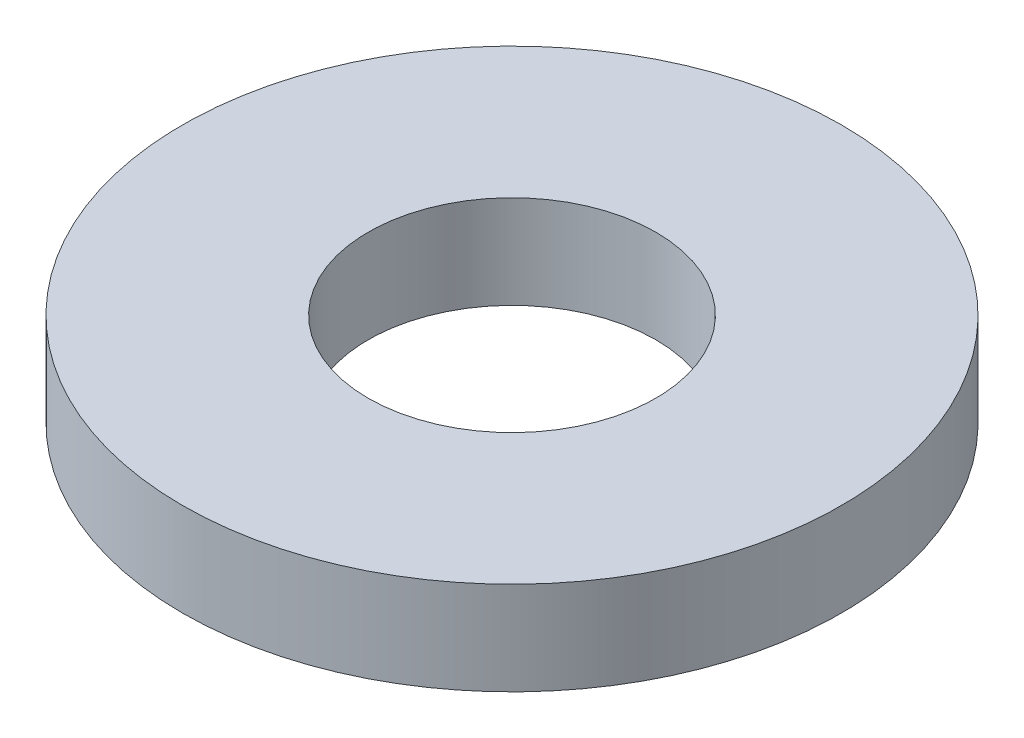
ISO-10303-21;
HEADER;
FILE_DESCRIPTION(('STEP AP214'),'2;1');
FILE_NAME('part.step','',(''),(''),'','','');
FILE_SCHEMA(('AUTOMOTIVE_DESIGN { 1 0 10303 214 1 1 1 1 }'));
ENDSEC;
DATA;
#1=APPLICATION_CONTEXT('core data for automotive mechanical design processes');
#2=APPLICATION_PROTOCOL_DEFINITION('international standard','automotive_design',2000,#1);
#3=PRODUCT_CONTEXT('',#1,'mechanical');
#4=PRODUCT('Part','Part','',(#3));
#5=PRODUCT_RELATED_PRODUCT_CATEGORY('part','',(#4));
#6=PRODUCT_DEFINITION_FORMATION('','',#4);
#7=PRODUCT_DEFINITION_CONTEXT('part definition',#1,'design');
#8=PRODUCT_DEFINITION('design','',#6,#7);
#9=PRODUCT_DEFINITION_SHAPE('','',#8);
#10=(LENGTH_UNIT() NAMED_UNIT(*) SI_UNIT(.MILLI.,.METRE.));
#11=(NAMED_UNIT(*) PLANE_ANGLE_UNIT() SI_UNIT($,.RADIAN.));
#12=(NAMED_UNIT(*) SI_UNIT($,.STERADIAN.) SOLID_ANGLE_UNIT());
#13=UNCERTAINTY_MEASURE_WITH_UNIT(LENGTH_MEASURE(1.E-05),#10,'distance_accuracy_value','');
#14=(GEOMETRIC_REPRESENTATION_CONTEXT(3) GLOBAL_UNCERTAINTY_ASSIGNED_CONTEXT((#13)) GLOBAL_UNIT_ASSIGNED_CONTEXT((#10,
#11,#12)) REPRESENTATION_CONTEXT('',''));
#15=CARTESIAN_POINT('',(0.,0.,0.));
#16=DIRECTION('',(0.,0.,1.));
#17=DIRECTION('',(1.,0.,0.));
#18=AXIS2_PLACEMENT_3D('',#15,#16,#17);
#19=CARTESIAN_POINT('',(0.,1.28,0.));
#20=DIRECTION('',(0.,1.,0.));
#21=DIRECTION('',(0.,0.,1.));
#22=AXIS2_PLACEMENT_3D('',#19,#20,#21);
#23=PLANE('',#22);
#24=CARTESIAN_POINT('',(0.,1.28,0.));
#25=DIRECTION('',(0.,1.,0.));
#26=DIRECTION('',(0.,0.,1.));
#27=AXIS2_PLACEMENT_3D('',#24,#25,#26);
#28=CIRCLE('',#27,4.525);
#29=CARTESIAN_POINT('',(0.,1.28,-4.525));
#30=VERTEX_POINT('',#29);
#31=EDGE_CURVE('E10',#30,#30,#28,.T.);
#32=ORIENTED_EDGE('',*,*,#31,.T.);
#33=EDGE_LOOP('',(#32));
#34=FACE_BOUND('',#33,.T.);
#35=CARTESIAN_POINT('',(0.,1.28,0.));
#36=DIRECTION('',(0.,1.,0.));
#37=DIRECTION('',(0.,0.,1.));
#38=AXIS2_PLACEMENT_3D('',#35,#36,#37);
#39=CIRCLE('',#38,1.975);
#40=CARTESIAN_POINT('',(0.,1.28,-1.975));
#41=VERTEX_POINT('',#40);
#42=EDGE_CURVE('E46',#41,#41,#39,.T.);
#43=ORIENTED_EDGE('',*,*,#42,.F.);
#44=EDGE_LOOP('',(#43));
#45=FACE_BOUND('',#44,.T.);
#46=ADVANCED_FACE('F35',(#34,#45),#23,.T.);
#47=CARTESIAN_POINT('',(0.,0.,0.));
#48=DIRECTION('',(0.,1.,0.));
#49=DIRECTION('',(0.,0.,1.));
#50=AXIS2_PLACEMENT_3D('',#47,#48,#49);
#51=PLANE('',#50);
#52=CARTESIAN_POINT('',(0.,0.,0.));
#53=DIRECTION('',(0.,1.,0.));
#54=DIRECTION('',(0.,0.,1.));
#55=AXIS2_PLACEMENT_3D('',#52,#53,#54);
#56=CIRCLE('',#55,4.525);
#57=CARTESIAN_POINT('',(0.,0.,-4.525));
#58=VERTEX_POINT('',#57);
#59=EDGE_CURVE('E39',#58,#58,#56,.T.);
#60=ORIENTED_EDGE('',*,*,#59,.F.);
#61=EDGE_LOOP('',(#60));
#62=FACE_BOUND('',#61,.T.);
#63=CARTESIAN_POINT('',(0.,0.,0.));
#64=DIRECTION('',(0.,1.,0.));
#65=DIRECTION('',(0.,0.,1.));
#66=AXIS2_PLACEMENT_3D('',#63,#64,#65);
#67=CIRCLE('',#66,1.975);
#68=CARTESIAN_POINT('',(0.,0.,-1.975));
#69=VERTEX_POINT('',#68);
#70=EDGE_CURVE('E48',#69,#69,#67,.T.);
#71=ORIENTED_EDGE('',*,*,#70,.T.);
#72=EDGE_LOOP('',(#71));
#73=FACE_BOUND('',#72,.T.);
#74=ADVANCED_FACE('F58',(#62,#73),#51,.F.);
#75=CARTESIAN_POINT('',(0.,1.28,0.));
#76=DIRECTION('',(0.,-1.,0.));
#77=DIRECTION('',(0.,0.,-1.));
#78=AXIS2_PLACEMENT_3D('',#75,#76,#77);
#79=CYLINDRICAL_SURFACE('',#78,4.525);
#80=CARTESIAN_POINT('',(0.,1.28,-4.525));
#81=CARTESIAN_POINT('',(0.,1.26666666666667,-4.525));
#82=CARTESIAN_POINT('',(0.,1.25333333333333,-4.525));
#83=CARTESIAN_POINT('',(0.,1.22666666666667,-4.525));
#84=CARTESIAN_POINT('',(0.,1.21333333333333,-4.525));
#85=CARTESIAN_POINT('',(0.,1.18666666666667,-4.525));
#86=CARTESIAN_POINT('',(0.,1.17333333333333,-4.525));
#87=CARTESIAN_POINT('',(0.,1.14666666666667,-4.525));
#88=CARTESIAN_POINT('',(0.,1.13333333333333,-4.525));
#89=CARTESIAN_POINT('',(0.,1.10666666666667,-4.525));
#90=CARTESIAN_POINT('',(0.,1.09333333333333,-4.525));
#91=CARTESIAN_POINT('',(0.,1.06666666666667,-4.525));
#92=CARTESIAN_POINT('',(0.,1.05333333333333,-4.525));
#93=CARTESIAN_POINT('',(0.,1.02666666666667,-4.525));
#94=CARTESIAN_POINT('',(0.,1.01333333333333,-4.525));
#95=CARTESIAN_POINT('',(0.,0.986666666666667,-4.525));
#96=CARTESIAN_POINT('',(0.,0.973333333333333,-4.525));
#97=CARTESIAN_POINT('',(0.,0.946666666666667,-4.525));
#98=CARTESIAN_POINT('',(0.,0.933333333333333,-4.525));
#99=CARTESIAN_POINT('',(0.,0.906666666666667,-4.525));
#100=CARTESIAN_POINT('',(0.,0.893333333333333,-4.525));
#101=CARTESIAN_POINT('',(0.,0.866666666666667,-4.525));
#102=CARTESIAN_POINT('',(0.,0.853333333333333,-4.525));
#103=CARTESIAN_POINT('',(0.,0.826666666666667,-4.525));
#104=CARTESIAN_POINT('',(0.,0.813333333333333,-4.525));
#105=CARTESIAN_POINT('',(0.,0.786666666666667,-4.525));
#106=CARTESIAN_POINT('',(0.,0.773333333333333,-4.525));
#107=CARTESIAN_POINT('',(0.,0.746666666666667,-4.525));
#108=CARTESIAN_POINT('',(0.,0.733333333333333,-4.525));
#109=CARTESIAN_POINT('',(0.,0.706666666666667,-4.525));
#110=CARTESIAN_POINT('',(0.,0.693333333333333,-4.525));
#111=CARTESIAN_POINT('',(0.,0.666666666666667,-4.525));
#112=CARTESIAN_POINT('',(0.,0.653333333333333,-4.525));
#113=CARTESIAN_POINT('',(0.,0.626666666666667,-4.525));
#114=CARTESIAN_POINT('',(0.,0.613333333333333,-4.525));
#115=CARTESIAN_POINT('',(0.,0.586666666666667,-4.525));
#116=CARTESIAN_POINT('',(0.,0.573333333333333,-4.525));
#117=CARTESIAN_POINT('',(0.,0.546666666666667,-4.525));
#118=CARTESIAN_POINT('',(0.,0.533333333333333,-4.525));
#119=CARTESIAN_POINT('',(0.,0.506666666666667,-4.525));
#120=CARTESIAN_POINT('',(0.,0.493333333333333,-4.525));
#121=CARTESIAN_POINT('',(0.,0.466666666666667,-4.525));
#122=CARTESIAN_POINT('',(0.,0.453333333333333,-4.525));
#123=CARTESIAN_POINT('',(0.,0.426666666666667,-4.525));
#124=CARTESIAN_POINT('',(0.,0.413333333333333,-4.525));
#125=CARTESIAN_POINT('',(0.,0.386666666666666,-4.525));
#126=CARTESIAN_POINT('',(0.,0.373333333333333,-4.525));
#127=CARTESIAN_POINT('',(0.,0.346666666666667,-4.525));
#128=CARTESIAN_POINT('',(0.,0.333333333333333,-4.525));
#129=CARTESIAN_POINT('',(0.,0.306666666666667,-4.525));
#130=CARTESIAN_POINT('',(0.,0.293333333333333,-4.525));
#131=CARTESIAN_POINT('',(0.,0.266666666666667,-4.525));
#132=CARTESIAN_POINT('',(0.,0.253333333333333,-4.525));
#133=CARTESIAN_POINT('',(0.,0.226666666666667,-4.525));
#134=CARTESIAN_POINT('',(0.,0.213333333333333,-4.525));
#135=CARTESIAN_POINT('',(0.,0.186666666666667,-4.525));
#136=CARTESIAN_POINT('',(0.,0.173333333333333,-4.525));
#137=CARTESIAN_POINT('',(0.,0.146666666666667,-4.525));
#138=CARTESIAN_POINT('',(0.,0.133333333333333,-4.525));
#139=CARTESIAN_POINT('',(0.,0.106666666666667,-4.525));
#140=CARTESIAN_POINT('',(0.,0.0933333333333334,-4.525));
#141=CARTESIAN_POINT('',(0.,0.0666666666666667,-4.525));
#142=CARTESIAN_POINT('',(0.,0.0533333333333334,-4.525));
#143=CARTESIAN_POINT('',(0.,0.0266666666666667,-4.525));
#144=CARTESIAN_POINT('',(0.,0.0133333333333334,-4.525));
#145=CARTESIAN_POINT('',(0.,0.,-4.525));
#146=B_SPLINE_CURVE_WITH_KNOTS('',3,(#80,#81,#82,#83,#84,#85,#86,#87,#88,#89,#90,#91,#92,#93,
#94,#95,#96,#97,#98,#99,#100,#101,#102,#103,#104,#105,#106,#107,#108,#109,#110,#111,#112,#113,
#114,#115,#116,#117,#118,#119,#120,#121,#122,#123,#124,#125,#126,#127,#128,#129,#130,#131,#132,
#133,#134,#135,#136,#137,#138,#139,#140,#141,#142,#143,#144,#145),.UNSPECIFIED.,.F.,.F.,(4,2,2,
2,2,2,2,2,2,2,2,2,2,2,2,2,2,2,2,2,2,2,2,2,2,2,2,2,2,2,2,2,4),(0.,0.0400000000000001,
0.0800000000000002,0.12,0.16,0.2,0.24,0.28,0.32,0.36,0.4,0.44,0.48,0.52,0.56,0.6,0.64,0.68,0.72,
0.76,0.8,0.84,0.88,0.92,0.96,1.,1.04,1.08,1.12,1.16,1.2,1.24,1.28),.UNSPECIFIED.);
#147=EDGE_CURVE('BSEAM37',#30,#58,#146,.T.);
#148=ORIENTED_EDGE('',*,*,#31,.F.);
#149=ORIENTED_EDGE('',*,*,#59,.T.);
#150=ORIENTED_EDGE('',*,*,#147,.T.);
#151=ORIENTED_EDGE('',*,*,#147,.F.);
#152=EDGE_LOOP('',(#148,#150,#149,#151));
#153=FACE_BOUND('',#152,.T.);
#154=ADVANCED_FACE('F37',(#153),#79,.T.);
#155=CARTESIAN_POINT('',(0.,1.28,0.));
#156=DIRECTION('',(0.,-1.,0.));
#157=DIRECTION('',(0.,0.,-1.));
#158=AXIS2_PLACEMENT_3D('',#155,#156,#157);
#159=CYLINDRICAL_SURFACE('',#158,1.975);
#160=CARTESIAN_POINT('',(0.,1.28,-1.975));
#161=CARTESIAN_POINT('',(0.,1.26666666666667,-1.975));
#162=CARTESIAN_POINT('',(0.,1.25333333333333,-1.975));
#163=CARTESIAN_POINT('',(0.,1.22666666666667,-1.975));
#164=CARTESIAN_POINT('',(0.,1.21333333333333,-1.975));
#165=CARTESIAN_POINT('',(0.,1.18666666666667,-1.975));
#166=CARTESIAN_POINT('',(0.,1.17333333333333,-1.975));
#167=CARTESIAN_POINT('',(0.,1.14666666666667,-1.975));
#168=CARTESIAN_POINT('',(0.,1.13333333333333,-1.975));
#169=CARTESIAN_POINT('',(0.,1.10666666666667,-1.975));
#170=CARTESIAN_POINT('',(0.,1.09333333333333,-1.975));
#171=CARTESIAN_POINT('',(0.,1.06666666666667,-1.975));
#172=CARTESIAN_POINT('',(0.,1.05333333333333,-1.975));
#173=CARTESIAN_POINT('',(0.,1.02666666666667,-1.975));
#174=CARTESIAN_POINT('',(0.,1.01333333333333,-1.975));
#175=CARTESIAN_POINT('',(0.,0.986666666666667,-1.975));
#176=CARTESIAN_POINT('',(0.,0.973333333333333,-1.975));
#177=CARTESIAN_POINT('',(0.,0.946666666666667,-1.975));
#178=CARTESIAN_POINT('',(0.,0.933333333333333,-1.975));
#179=CARTESIAN_POINT('',(0.,0.906666666666667,-1.975));
#180=CARTESIAN_POINT('',(0.,0.893333333333333,-1.975));
#181=CARTESIAN_POINT('',(0.,0.866666666666667,-1.975));
#182=CARTESIAN_POINT('',(0.,0.853333333333333,-1.975));
#183=CARTESIAN_POINT('',(0.,0.826666666666667,-1.975));
#184=CARTESIAN_POINT('',(0.,0.813333333333333,-1.975));
#185=CARTESIAN_POINT('',(0.,0.786666666666667,-1.975));
#186=CARTESIAN_POINT('',(0.,0.773333333333333,-1.975));
#187=CARTESIAN_POINT('',(0.,0.746666666666667,-1.975));
#188=CARTESIAN_POINT('',(0.,0.733333333333333,-1.975));
#189=CARTESIAN_POINT('',(0.,0.706666666666667,-1.975));
#190=CARTESIAN_POINT('',(0.,0.693333333333333,-1.975));
#191=CARTESIAN_POINT('',(0.,0.666666666666667,-1.975));
#192=CARTESIAN_POINT('',(0.,0.653333333333333,-1.975));
#193=CARTESIAN_POINT('',(0.,0.626666666666667,-1.975));
#194=CARTESIAN_POINT('',(0.,0.613333333333333,-1.975));
#195=CARTESIAN_POINT('',(0.,0.586666666666667,-1.975));
#196=CARTESIAN_POINT('',(0.,0.573333333333333,-1.975));
#197=CARTESIAN_POINT('',(0.,0.546666666666667,-1.975));
#198=CARTESIAN_POINT('',(0.,0.533333333333333,-1.975));
#199=CARTESIAN_POINT('',(0.,0.506666666666667,-1.975));
#200=CARTESIAN_POINT('',(0.,0.493333333333333,-1.975));
#201=CARTESIAN_POINT('',(0.,0.466666666666667,-1.975));
#202=CARTESIAN_POINT('',(0.,0.453333333333333,-1.975));
#203=CARTESIAN_POINT('',(0.,0.426666666666667,-1.975));
#204=CARTESIAN_POINT('',(0.,0.413333333333333,-1.975));
#205=CARTESIAN_POINT('',(0.,0.386666666666667,-1.975));
#206=CARTESIAN_POINT('',(0.,0.373333333333333,-1.975));
#207=CARTESIAN_POINT('',(0.,0.346666666666667,-1.975));
#208=CARTESIAN_POINT('',(0.,0.333333333333333,-1.975));
#209=CARTESIAN_POINT('',(0.,0.306666666666667,-1.975));
#210=CARTESIAN_POINT('',(0.,0.293333333333333,-1.975));
#211=CARTESIAN_POINT('',(0.,0.266666666666667,-1.975));
#212=CARTESIAN_POINT('',(0.,0.253333333333333,-1.975));
#213=CARTESIAN_POINT('',(0.,0.226666666666667,-1.975));
#214=CARTESIAN_POINT('',(0.,0.213333333333333,-1.975));
#215=CARTESIAN_POINT('',(0.,0.186666666666667,-1.975));
#216=CARTESIAN_POINT('',(0.,0.173333333333333,-1.975));
#217=CARTESIAN_POINT('',(0.,0.146666666666667,-1.975));
#218=CARTESIAN_POINT('',(0.,0.133333333333333,-1.975));
#219=CARTESIAN_POINT('',(0.,0.106666666666667,-1.975));
#220=CARTESIAN_POINT('',(0.,0.0933333333333334,-1.975));
#221=CARTESIAN_POINT('',(0.,0.0666666666666667,-1.975));
#222=CARTESIAN_POINT('',(0.,0.0533333333333334,-1.975));
#223=CARTESIAN_POINT('',(0.,0.0266666666666667,-1.975));
#224=CARTESIAN_POINT('',(0.,0.0133333333333334,-1.975));
#225=CARTESIAN_POINT('',(0.,0.,-1.975));
#226=B_SPLINE_CURVE_WITH_KNOTS('',3,(#160,#161,#162,#163,#164,#165,#166,#167,#168,#169,#170,
#171,#172,#173,#174,#175,#176,#177,#178,#179,#180,#181,#182,#183,#184,#185,#186,#187,#188,#189,
#190,#191,#192,#193,#194,#195,#196,#197,#198,#199,#200,#201,#202,#203,#204,#205,#206,#207,#208,
#209,#210,#211,#212,#213,#214,#215,#216,#217,#218,#219,#220,#221,#222,#223,#224,#225),
.UNSPECIFIED.,.F.,.F.,(4,2,2,2,2,2,2,2,2,2,2,2,2,2,2,2,2,2,2,2,2,2,2,2,2,2,2,2,2,2,2,2,4),(0.,
0.0399999999999999,0.0799999999999998,0.12,0.16,0.2,0.24,0.28,0.32,0.36,0.4,0.44,0.48,0.52,0.56,
0.6,0.64,0.68,0.72,0.76,0.8,0.84,0.88,0.92,0.96,1.,1.04,1.08,1.12,1.16,1.2,1.24,1.28),.UNSPECIFIED.);
#227=EDGE_CURVE('BSEAM54',#41,#69,#226,.T.);
#228=ORIENTED_EDGE('',*,*,#42,.T.);
#229=ORIENTED_EDGE('',*,*,#70,.F.);
#230=ORIENTED_EDGE('',*,*,#227,.T.);
#231=ORIENTED_EDGE('',*,*,#227,.F.);
#232=EDGE_LOOP('',(#228,#230,#229,#231));
#233=FACE_BOUND('',#232,.T.);
#234=ADVANCED_FACE('F54',(#233),#159,.F.);
#235=CLOSED_SHELL('',(#46,#74,#154,#234));
#236=MANIFOLD_SOLID_BREP('B2',#235);
#237=ADVANCED_BREP_SHAPE_REPRESENTATION('',(#18,#236),#14);
#238=SHAPE_DEFINITION_REPRESENTATION(#9,#237);
ENDSEC;
END-ISO-10303-21;
